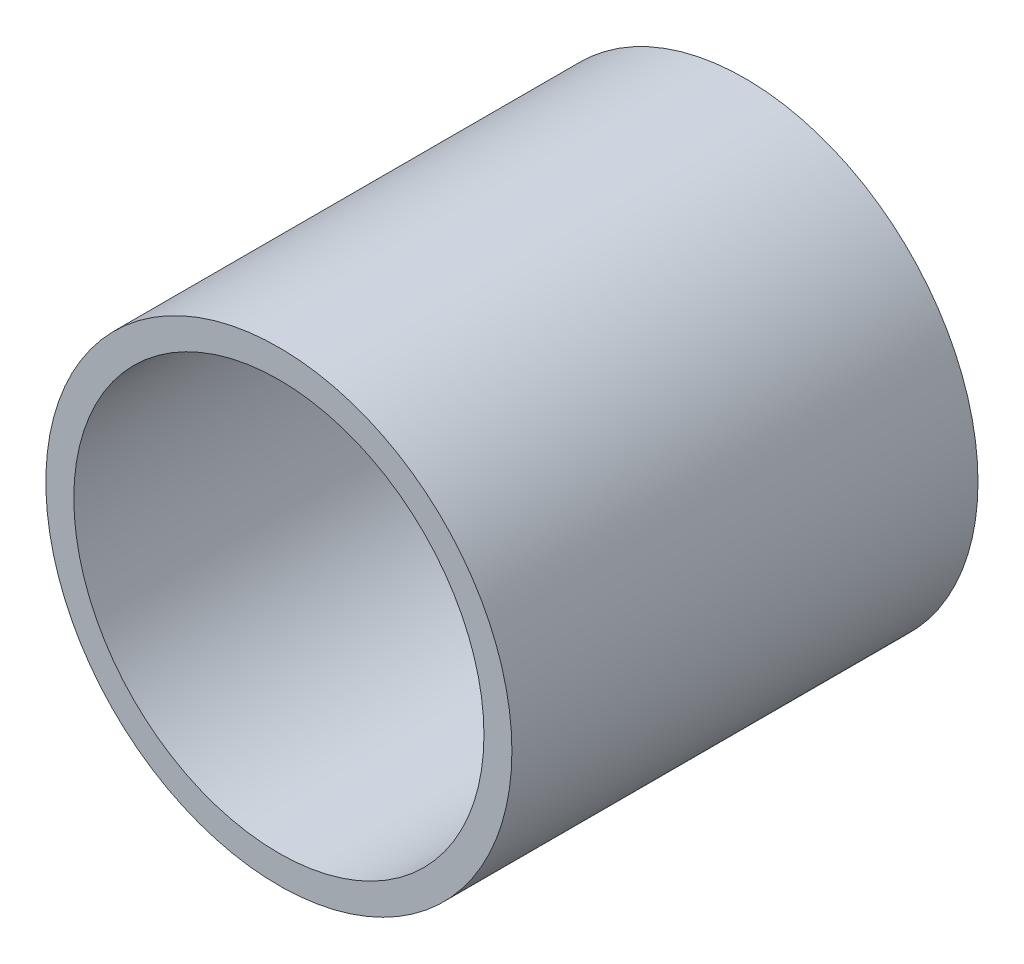
ISO-10303-21;
HEADER;
FILE_DESCRIPTION(('STEP AP214'),'2;1');
FILE_NAME('part.step','',(''),(''),'','','');
FILE_SCHEMA(('AUTOMOTIVE_DESIGN { 1 0 10303 214 1 1 1 1 }'));
ENDSEC;
DATA;
#1=APPLICATION_CONTEXT('core data for automotive mechanical design processes');
#2=APPLICATION_PROTOCOL_DEFINITION('international standard','automotive_design',2000,#1);
#3=PRODUCT_CONTEXT('',#1,'mechanical');
#4=PRODUCT('Part','Part','',(#3));
#5=PRODUCT_RELATED_PRODUCT_CATEGORY('part','',(#4));
#6=PRODUCT_DEFINITION_FORMATION('','',#4);
#7=PRODUCT_DEFINITION_CONTEXT('part definition',#1,'design');
#8=PRODUCT_DEFINITION('design','',#6,#7);
#9=PRODUCT_DEFINITION_SHAPE('','',#8);
#10=(LENGTH_UNIT() NAMED_UNIT(*) SI_UNIT(.MILLI.,.METRE.));
#11=(NAMED_UNIT(*) PLANE_ANGLE_UNIT() SI_UNIT($,.RADIAN.));
#12=(NAMED_UNIT(*) SI_UNIT($,.STERADIAN.) SOLID_ANGLE_UNIT());
#13=UNCERTAINTY_MEASURE_WITH_UNIT(LENGTH_MEASURE(1.E-05),#10,'distance_accuracy_value','');
#14=(GEOMETRIC_REPRESENTATION_CONTEXT(3) GLOBAL_UNCERTAINTY_ASSIGNED_CONTEXT((#13)) GLOBAL_UNIT_ASSIGNED_CONTEXT((#10,
#11,#12)) REPRESENTATION_CONTEXT('',''));
#15=CARTESIAN_POINT('',(0.,0.,0.));
#16=DIRECTION('',(0.,0.,1.));
#17=DIRECTION('',(1.,0.,0.));
#18=AXIS2_PLACEMENT_3D('',#15,#16,#17);
#19=CARTESIAN_POINT('',(0.,0.,25.));
#20=DIRECTION('',(0.,0.,1.));
#21=DIRECTION('',(1.,0.,0.));
#22=AXIS2_PLACEMENT_3D('',#19,#20,#21);
#23=PLANE('',#22);
#24=CARTESIAN_POINT('',(0.,0.,25.));
#25=DIRECTION('',(0.,0.,1.));
#26=DIRECTION('',(1.,0.,0.));
#27=AXIS2_PLACEMENT_3D('',#24,#25,#26);
#28=CIRCLE('',#27,25.);
#29=CARTESIAN_POINT('',(25.,0.,25.));
#30=VERTEX_POINT('',#29);
#31=EDGE_CURVE('E10',#30,#30,#28,.T.);
#32=ORIENTED_EDGE('',*,*,#31,.T.);
#33=EDGE_LOOP('',(#32));
#34=FACE_BOUND('',#33,.T.);
#35=CARTESIAN_POINT('',(0.,0.,25.));
#36=DIRECTION('',(0.,0.,1.));
#37=DIRECTION('',(1.,0.,0.));
#38=AXIS2_PLACEMENT_3D('',#35,#36,#37);
#39=CIRCLE('',#38,22.);
#40=CARTESIAN_POINT('',(22.,0.,25.));
#41=VERTEX_POINT('',#40);
#42=EDGE_CURVE('E54',#41,#41,#39,.T.);
#43=ORIENTED_EDGE('',*,*,#42,.F.);
#44=EDGE_LOOP('',(#43));
#45=FACE_BOUND('',#44,.T.);
#46=ADVANCED_FACE('F41',(#34,#45),#23,.T.);
#47=CARTESIAN_POINT('',(0.,0.,-25.));
#48=DIRECTION('',(0.,0.,1.));
#49=DIRECTION('',(1.,0.,0.));
#50=AXIS2_PLACEMENT_3D('',#47,#48,#49);
#51=PLANE('',#50);
#52=CARTESIAN_POINT('',(0.,0.,-25.));
#53=DIRECTION('',(0.,0.,1.));
#54=DIRECTION('',(1.,0.,0.));
#55=AXIS2_PLACEMENT_3D('',#52,#53,#54);
#56=CIRCLE('',#55,25.);
#57=CARTESIAN_POINT('',(25.,0.,-25.));
#58=VERTEX_POINT('',#57);
#59=EDGE_CURVE('E45',#58,#58,#56,.T.);
#60=ORIENTED_EDGE('',*,*,#59,.F.);
#61=EDGE_LOOP('',(#60));
#62=FACE_BOUND('',#61,.T.);
#63=CARTESIAN_POINT('',(0.,0.,-25.));
#64=DIRECTION('',(0.,0.,1.));
#65=DIRECTION('',(1.,0.,0.));
#66=AXIS2_PLACEMENT_3D('',#63,#64,#65);
#67=CIRCLE('',#66,22.);
#68=CARTESIAN_POINT('',(22.,0.,-25.));
#69=VERTEX_POINT('',#68);
#70=EDGE_CURVE('E56',#69,#69,#67,.T.);
#71=ORIENTED_EDGE('',*,*,#70,.T.);
#72=EDGE_LOOP('',(#71));
#73=FACE_BOUND('',#72,.T.);
#74=ADVANCED_FACE('F68',(#62,#73),#51,.F.);
#75=CARTESIAN_POINT('',(0.,0.,25.));
#76=DIRECTION('',(0.,0.,-1.));
#77=DIRECTION('',(-1.,0.,0.));
#78=AXIS2_PLACEMENT_3D('',#75,#76,#77);
#79=CYLINDRICAL_SURFACE('',#78,25.);
#80=ORIENTED_EDGE('',*,*,#31,.F.);
#81=EDGE_LOOP('',(#80));
#82=FACE_BOUND('',#81,.T.);
#83=ORIENTED_EDGE('',*,*,#59,.T.);
#84=EDGE_LOOP('',(#83));
#85=FACE_BOUND('',#84,.T.);
#86=ADVANCED_FACE('F43',(#82,#85),#79,.T.);
#87=CARTESIAN_POINT('',(0.,0.,25.));
#88=DIRECTION('',(0.,0.,-1.));
#89=DIRECTION('',(-1.,0.,0.));
#90=AXIS2_PLACEMENT_3D('',#87,#88,#89);
#91=CYLINDRICAL_SURFACE('',#90,22.);
#92=ORIENTED_EDGE('',*,*,#42,.T.);
#93=EDGE_LOOP('',(#92));
#94=FACE_BOUND('',#93,.T.);
#95=ORIENTED_EDGE('',*,*,#70,.F.);
#96=EDGE_LOOP('',(#95));
#97=FACE_BOUND('',#96,.T.);
#98=ADVANCED_FACE('F64',(#94,#97),#91,.F.);
#99=CLOSED_SHELL('',(#46,#74,#86,#98));
#100=MANIFOLD_SOLID_BREP('B2',#99);
#101=ADVANCED_BREP_SHAPE_REPRESENTATION('',(#18,#100),#14);
#102=SHAPE_DEFINITION_REPRESENTATION(#9,#101);
ENDSEC;
END-ISO-10303-21;
